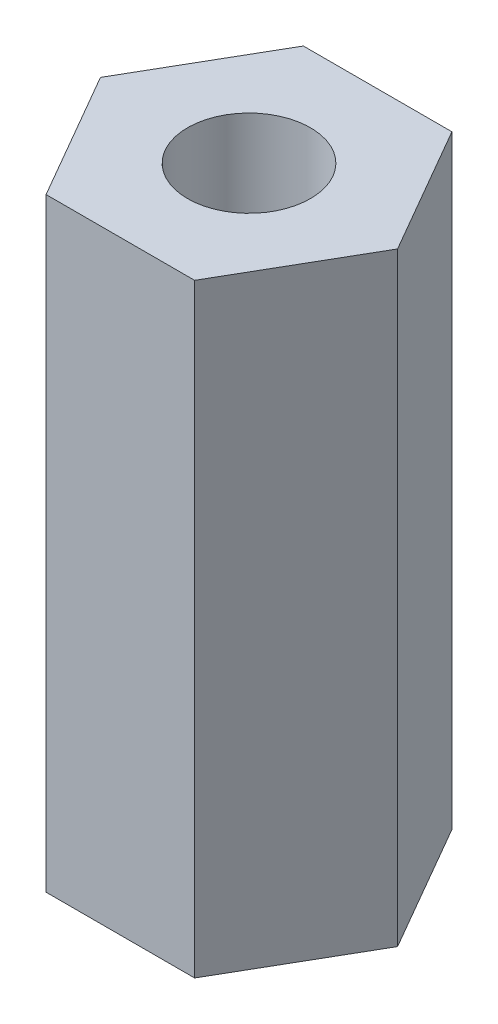
ISO-10303-21;
HEADER;
FILE_DESCRIPTION(('STEP AP214'),'2;1');
FILE_NAME('part.step','',(''),(''),'','','');
FILE_SCHEMA(('AUTOMOTIVE_DESIGN { 1 0 10303 214 1 1 1 1 }'));
ENDSEC;
DATA;
#1=APPLICATION_CONTEXT('core data for automotive mechanical design processes');
#2=APPLICATION_PROTOCOL_DEFINITION('international standard','automotive_design',2000,#1);
#3=PRODUCT_CONTEXT('',#1,'mechanical');
#4=PRODUCT('Part','Part','',(#3));
#5=PRODUCT_RELATED_PRODUCT_CATEGORY('part','',(#4));
#6=PRODUCT_DEFINITION_FORMATION('','',#4);
#7=PRODUCT_DEFINITION_CONTEXT('part definition',#1,'design');
#8=PRODUCT_DEFINITION('design','',#6,#7);
#9=PRODUCT_DEFINITION_SHAPE('','',#8);
#10=(LENGTH_UNIT() NAMED_UNIT(*) SI_UNIT(.MILLI.,.METRE.));
#11=(NAMED_UNIT(*) PLANE_ANGLE_UNIT() SI_UNIT($,.RADIAN.));
#12=(NAMED_UNIT(*) SI_UNIT($,.STERADIAN.) SOLID_ANGLE_UNIT());
#13=UNCERTAINTY_MEASURE_WITH_UNIT(LENGTH_MEASURE(1.E-05),#10,'distance_accuracy_value','');
#14=(GEOMETRIC_REPRESENTATION_CONTEXT(3) GLOBAL_UNCERTAINTY_ASSIGNED_CONTEXT((#13)) GLOBAL_UNIT_ASSIGNED_CONTEXT((#10,
#11,#12)) REPRESENTATION_CONTEXT('',''));
#15=CARTESIAN_POINT('',(0.,0.,0.));
#16=DIRECTION('',(0.,0.,1.));
#17=DIRECTION('',(1.,0.,0.));
#18=AXIS2_PLACEMENT_3D('',#15,#16,#17);
#19=CARTESIAN_POINT('',(2.29502505505567,18.669,3.97510000000004));
#20=DIRECTION('',(-0.86602540378444,0.,-0.499999999999998));
#21=DIRECTION('',(-0.499999999999998,0.,0.86602540378444));
#22=AXIS2_PLACEMENT_3D('',#19,#20,#21);
#23=PLANE('',#22);
#24=DIRECTION('',(0.499999999999997,0.,-0.86602540378444));
#25=VECTOR('',#24,1.);
#26=CARTESIAN_POINT('',(2.29502505505567,0.,3.97510000000004));
#27=LINE('',#26,#25);
#28=CARTESIAN_POINT('',(2.29502505505567,0.,3.97510000000004));
#29=VERTEX_POINT('',#28);
#30=CARTESIAN_POINT('',(4.59005011011136,0.,0.));
#31=VERTEX_POINT('',#30);
#32=EDGE_CURVE('E100',#29,#31,#27,.T.);
#33=ORIENTED_EDGE('',*,*,#32,.T.);
#34=DIRECTION('',(0.,-1.,0.));
#35=VECTOR('',#34,1.);
#36=CARTESIAN_POINT('',(4.59005011011136,18.669,0.));
#37=LINE('',#36,#35);
#38=CARTESIAN_POINT('',(4.59005011011136,18.669,0.));
#39=VERTEX_POINT('',#38);
#40=EDGE_CURVE('E13',#39,#31,#37,.T.);
#41=ORIENTED_EDGE('',*,*,#40,.F.);
#42=DIRECTION('',(0.499999999999997,0.,-0.86602540378444));
#43=VECTOR('',#42,1.);
#44=CARTESIAN_POINT('',(2.29502505505567,18.669,3.97510000000004));
#45=LINE('',#44,#43);
#46=CARTESIAN_POINT('',(2.29502505505567,18.669,3.97510000000004));
#47=VERTEX_POINT('',#46);
#48=EDGE_CURVE('E128',#47,#39,#45,.T.);
#49=ORIENTED_EDGE('',*,*,#48,.F.);
#50=DIRECTION('',(0.,-1.,0.));
#51=VECTOR('',#50,1.);
#52=CARTESIAN_POINT('',(2.29502505505567,18.669,3.97510000000004));
#53=LINE('',#52,#51);
#54=EDGE_CURVE('E113',#47,#29,#53,.T.);
#55=ORIENTED_EDGE('',*,*,#54,.T.);
#56=EDGE_LOOP('',(#33,#41,#49,#55));
#57=FACE_BOUND('',#56,.T.);
#58=ADVANCED_FACE('F44',(#57),#23,.F.);
#59=CARTESIAN_POINT('',(4.59005011011136,18.669,0.));
#60=DIRECTION('',(-0.866025403784439,0.,0.5));
#61=DIRECTION('',(0.5,0.,0.866025403784439));
#62=AXIS2_PLACEMENT_3D('',#59,#60,#61);
#63=PLANE('',#62);
#64=DIRECTION('',(-0.5,0.,-0.866025403784439));
#65=VECTOR('',#64,1.);
#66=CARTESIAN_POINT('',(4.59005011011136,0.,0.));
#67=LINE('',#66,#65);
#68=CARTESIAN_POINT('',(2.29502505505567,0.,-3.97510000000004));
#69=VERTEX_POINT('',#68);
#70=EDGE_CURVE('E96',#31,#69,#67,.T.);
#71=ORIENTED_EDGE('',*,*,#70,.T.);
#72=DIRECTION('',(0.,-1.,0.));
#73=VECTOR('',#72,1.);
#74=CARTESIAN_POINT('',(2.29502505505567,18.669,-3.97510000000004));
#75=LINE('',#74,#73);
#76=CARTESIAN_POINT('',(2.29502505505567,18.669,-3.97510000000004));
#77=VERTEX_POINT('',#76);
#78=EDGE_CURVE('E51',#77,#69,#75,.T.);
#79=ORIENTED_EDGE('',*,*,#78,.F.);
#80=DIRECTION('',(-0.5,0.,-0.866025403784439));
#81=VECTOR('',#80,1.);
#82=CARTESIAN_POINT('',(4.59005011011136,18.669,0.));
#83=LINE('',#82,#81);
#84=EDGE_CURVE('E109',#39,#77,#83,.T.);
#85=ORIENTED_EDGE('',*,*,#84,.F.);
#86=ORIENTED_EDGE('',*,*,#40,.T.);
#87=EDGE_LOOP('',(#71,#79,#85,#86));
#88=FACE_BOUND('',#87,.T.);
#89=ADVANCED_FACE('F108',(#88),#63,.F.);
#90=CARTESIAN_POINT('',(2.29502505505567,18.669,-3.97510000000004));
#91=DIRECTION('',(0.,0.,1.));
#92=DIRECTION('',(1.,0.,0.));
#93=AXIS2_PLACEMENT_3D('',#90,#91,#92);
#94=PLANE('',#93);
#95=DIRECTION('',(-1.,0.,0.));
#96=VECTOR('',#95,1.);
#97=CARTESIAN_POINT('',(2.29502505505567,0.,-3.97510000000004));
#98=LINE('',#97,#96);
#99=CARTESIAN_POINT('',(-2.2950250550557,0.,-3.97510000000004));
#100=VERTEX_POINT('',#99);
#101=EDGE_CURVE('E102',#69,#100,#98,.T.);
#102=ORIENTED_EDGE('',*,*,#101,.T.);
#103=DIRECTION('',(0.,-1.,0.));
#104=VECTOR('',#103,1.);
#105=CARTESIAN_POINT('',(-2.2950250550557,18.669,-3.97510000000004));
#106=LINE('',#105,#104);
#107=CARTESIAN_POINT('',(-2.2950250550557,18.669,-3.97510000000004));
#108=VERTEX_POINT('',#107);
#109=EDGE_CURVE('E144',#108,#100,#106,.T.);
#110=ORIENTED_EDGE('',*,*,#109,.F.);
#111=DIRECTION('',(-1.,0.,0.));
#112=VECTOR('',#111,1.);
#113=CARTESIAN_POINT('',(2.29502505505567,18.669,-3.97510000000004));
#114=LINE('',#113,#112);
#115=EDGE_CURVE('E131',#77,#108,#114,.T.);
#116=ORIENTED_EDGE('',*,*,#115,.F.);
#117=ORIENTED_EDGE('',*,*,#78,.T.);
#118=EDGE_LOOP('',(#102,#110,#116,#117));
#119=FACE_BOUND('',#118,.T.);
#120=ADVANCED_FACE('F148',(#119),#94,.F.);
#121=CARTESIAN_POINT('',(-2.2950250550557,18.669,-3.97510000000004));
#122=DIRECTION('',(0.866025403784439,0.,0.499999999999999));
#123=DIRECTION('',(0.499999999999999,0.,-0.866025403784439));
#124=AXIS2_PLACEMENT_3D('',#121,#122,#123);
#125=PLANE('',#124);
#126=DIRECTION('',(-0.499999999999999,0.,0.866025403784439));
#127=VECTOR('',#126,1.);
#128=CARTESIAN_POINT('',(-2.2950250550557,0.,-3.97510000000004));
#129=LINE('',#128,#127);
#130=CARTESIAN_POINT('',(-4.59005011011139,0.,0.));
#131=VERTEX_POINT('',#130);
#132=EDGE_CURVE('E122',#100,#131,#129,.T.);
#133=ORIENTED_EDGE('',*,*,#132,.T.);
#134=DIRECTION('',(0.,-1.,0.));
#135=VECTOR('',#134,1.);
#136=CARTESIAN_POINT('',(-4.59005011011139,18.669,0.));
#137=LINE('',#136,#135);
#138=CARTESIAN_POINT('',(-4.59005011011139,18.669,0.));
#139=VERTEX_POINT('',#138);
#140=EDGE_CURVE('E141',#139,#131,#137,.T.);
#141=ORIENTED_EDGE('',*,*,#140,.F.);
#142=DIRECTION('',(-0.499999999999999,0.,0.866025403784439));
#143=VECTOR('',#142,1.);
#144=CARTESIAN_POINT('',(-2.2950250550557,18.669,-3.97510000000004));
#145=LINE('',#144,#143);
#146=EDGE_CURVE('E133',#108,#139,#145,.T.);
#147=ORIENTED_EDGE('',*,*,#146,.F.);
#148=ORIENTED_EDGE('',*,*,#109,.T.);
#149=EDGE_LOOP('',(#133,#141,#147,#148));
#150=FACE_BOUND('',#149,.T.);
#151=ADVANCED_FACE('F154',(#150),#125,.F.);
#152=CARTESIAN_POINT('',(-4.59005011011139,18.669,0.));
#153=DIRECTION('',(0.86602540378444,0.,-0.499999999999998));
#154=DIRECTION('',(-0.499999999999998,0.,-0.86602540378444));
#155=AXIS2_PLACEMENT_3D('',#152,#153,#154);
#156=PLANE('',#155);
#157=DIRECTION('',(0.499999999999998,0.,0.86602540378444));
#158=VECTOR('',#157,1.);
#159=CARTESIAN_POINT('',(-4.59005011011139,0.,0.));
#160=LINE('',#159,#158);
#161=CARTESIAN_POINT('',(-2.2950250550557,0.,3.97510000000004));
#162=VERTEX_POINT('',#161);
#163=EDGE_CURVE('E124',#131,#162,#160,.T.);
#164=ORIENTED_EDGE('',*,*,#163,.T.);
#165=DIRECTION('',(0.,-1.,0.));
#166=VECTOR('',#165,1.);
#167=CARTESIAN_POINT('',(-2.2950250550557,18.669,3.97510000000004));
#168=LINE('',#167,#166);
#169=CARTESIAN_POINT('',(-2.2950250550557,18.669,3.97510000000004));
#170=VERTEX_POINT('',#169);
#171=EDGE_CURVE('E138',#170,#162,#168,.T.);
#172=ORIENTED_EDGE('',*,*,#171,.F.);
#173=DIRECTION('',(0.499999999999998,0.,0.86602540378444));
#174=VECTOR('',#173,1.);
#175=CARTESIAN_POINT('',(-4.59005011011139,18.669,0.));
#176=LINE('',#175,#174);
#177=EDGE_CURVE('E63',#139,#170,#176,.T.);
#178=ORIENTED_EDGE('',*,*,#177,.F.);
#179=ORIENTED_EDGE('',*,*,#140,.T.);
#180=EDGE_LOOP('',(#164,#172,#178,#179));
#181=FACE_BOUND('',#180,.T.);
#182=ADVANCED_FACE('F157',(#181),#156,.F.);
#183=CARTESIAN_POINT('',(-2.2950250550557,18.669,3.97510000000004));
#184=DIRECTION('',(0.,0.,-1.));
#185=DIRECTION('',(-1.,0.,0.));
#186=AXIS2_PLACEMENT_3D('',#183,#184,#185);
#187=PLANE('',#186);
#188=DIRECTION('',(1.,0.,0.));
#189=VECTOR('',#188,1.);
#190=CARTESIAN_POINT('',(-2.2950250550557,0.,3.97510000000004));
#191=LINE('',#190,#189);
#192=EDGE_CURVE('E126',#162,#29,#191,.T.);
#193=ORIENTED_EDGE('',*,*,#192,.T.);
#194=ORIENTED_EDGE('',*,*,#54,.F.);
#195=DIRECTION('',(1.,0.,0.));
#196=VECTOR('',#195,1.);
#197=CARTESIAN_POINT('',(-2.2950250550557,18.669,3.97510000000004));
#198=LINE('',#197,#196);
#199=EDGE_CURVE('E58',#170,#47,#198,.T.);
#200=ORIENTED_EDGE('',*,*,#199,.F.);
#201=ORIENTED_EDGE('',*,*,#171,.T.);
#202=EDGE_LOOP('',(#193,#194,#200,#201));
#203=FACE_BOUND('',#202,.T.);
#204=ADVANCED_FACE('F159',(#203),#187,.F.);
#205=CARTESIAN_POINT('',(6.88507516516704,18.669,-3.97510000000004));
#206=DIRECTION('',(0.,1.,0.));
#207=DIRECTION('',(0.,0.,1.));
#208=AXIS2_PLACEMENT_3D('',#205,#206,#207);
#209=PLANE('',#208);
#210=CARTESIAN_POINT('',(0.,18.669,0.));
#211=DIRECTION('',(0.,1.,0.));
#212=DIRECTION('',(0.,0.,1.));
#213=AXIS2_PLACEMENT_3D('',#210,#211,#212);
#214=CIRCLE('',#213,1.89864999999999);
#215=CARTESIAN_POINT('',(0.,18.669,1.89864999999999));
#216=VERTEX_POINT('',#215);
#217=EDGE_CURVE('E114',#216,#216,#214,.T.);
#218=ORIENTED_EDGE('',*,*,#217,.F.);
#219=EDGE_LOOP('',(#218));
#220=FACE_BOUND('',#219,.T.);
#221=ORIENTED_EDGE('',*,*,#48,.T.);
#222=ORIENTED_EDGE('',*,*,#84,.T.);
#223=ORIENTED_EDGE('',*,*,#115,.T.);
#224=ORIENTED_EDGE('',*,*,#146,.T.);
#225=ORIENTED_EDGE('',*,*,#177,.T.);
#226=ORIENTED_EDGE('',*,*,#199,.T.);
#227=EDGE_LOOP('',(#221,#222,#223,#224,#225,#226));
#228=FACE_BOUND('',#227,.T.);
#229=ADVANCED_FACE('F151',(#220,#228),#209,.T.);
#230=CARTESIAN_POINT('',(6.88507516516704,0.,-3.97510000000004));
#231=DIRECTION('',(0.,1.,0.));
#232=DIRECTION('',(0.,0.,1.));
#233=AXIS2_PLACEMENT_3D('',#230,#231,#232);
#234=PLANE('',#233);
#235=CARTESIAN_POINT('',(0.,0.,0.));
#236=DIRECTION('',(0.,1.,0.));
#237=DIRECTION('',(0.,0.,1.));
#238=AXIS2_PLACEMENT_3D('',#235,#236,#237);
#239=CIRCLE('',#238,1.89865);
#240=CARTESIAN_POINT('',(0.,0.,1.89865));
#241=VERTEX_POINT('',#240);
#242=EDGE_CURVE('E117',#241,#241,#239,.T.);
#243=ORIENTED_EDGE('',*,*,#242,.T.);
#244=EDGE_LOOP('',(#243));
#245=FACE_BOUND('',#244,.T.);
#246=ORIENTED_EDGE('',*,*,#32,.F.);
#247=ORIENTED_EDGE('',*,*,#192,.F.);
#248=ORIENTED_EDGE('',*,*,#163,.F.);
#249=ORIENTED_EDGE('',*,*,#132,.F.);
#250=ORIENTED_EDGE('',*,*,#101,.F.);
#251=ORIENTED_EDGE('',*,*,#70,.F.);
#252=EDGE_LOOP('',(#246,#247,#248,#249,#250,#251));
#253=FACE_BOUND('',#252,.T.);
#254=ADVANCED_FACE('F97',(#245,#253),#234,.F.);
#255=CARTESIAN_POINT('',(0.,18.669,0.));
#256=DIRECTION('',(0.,1.,0.));
#257=DIRECTION('',(0.,0.,1.));
#258=AXIS2_PLACEMENT_3D('',#255,#256,#257);
#259=CYLINDRICAL_SURFACE('',#258,1.89864999999999);
#260=ORIENTED_EDGE('',*,*,#242,.F.);
#261=EDGE_LOOP('',(#260));
#262=FACE_BOUND('',#261,.T.);
#263=ORIENTED_EDGE('',*,*,#217,.T.);
#264=EDGE_LOOP('',(#263));
#265=FACE_BOUND('',#264,.T.);
#266=ADVANCED_FACE('F206',(#262,#265),#259,.F.);
#267=CLOSED_SHELL('',(#58,#89,#120,#151,#182,#204,#229,#254,#266));
#268=MANIFOLD_SOLID_BREP('B2',#267);
#269=ADVANCED_BREP_SHAPE_REPRESENTATION('',(#18,#268),#14);
#270=SHAPE_DEFINITION_REPRESENTATION(#9,#269);
ENDSEC;
END-ISO-10303-21;
